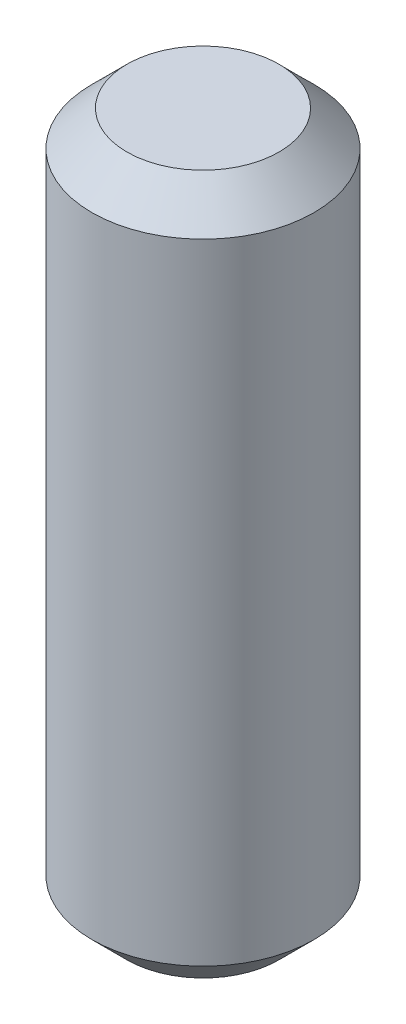
ISO-10303-21;
HEADER;
FILE_DESCRIPTION(('STEP AP214'),'2;1');
FILE_NAME('part.step','',(''),(''),'','','');
FILE_SCHEMA(('AUTOMOTIVE_DESIGN { 1 0 10303 214 1 1 1 1 }'));
ENDSEC;
DATA;
#1=APPLICATION_CONTEXT('core data for automotive mechanical design processes');
#2=APPLICATION_PROTOCOL_DEFINITION('international standard','automotive_design',2000,#1);
#3=PRODUCT_CONTEXT('',#1,'mechanical');
#4=PRODUCT('Part','Part','',(#3));
#5=PRODUCT_RELATED_PRODUCT_CATEGORY('part','',(#4));
#6=PRODUCT_DEFINITION_FORMATION('','',#4);
#7=PRODUCT_DEFINITION_CONTEXT('part definition',#1,'design');
#8=PRODUCT_DEFINITION('design','',#6,#7);
#9=PRODUCT_DEFINITION_SHAPE('','',#8);
#10=(LENGTH_UNIT() NAMED_UNIT(*) SI_UNIT(.MILLI.,.METRE.));
#11=(NAMED_UNIT(*) PLANE_ANGLE_UNIT() SI_UNIT($,.RADIAN.));
#12=(NAMED_UNIT(*) SI_UNIT($,.STERADIAN.) SOLID_ANGLE_UNIT());
#13=UNCERTAINTY_MEASURE_WITH_UNIT(LENGTH_MEASURE(1.E-05),#10,'distance_accuracy_value','');
#14=(GEOMETRIC_REPRESENTATION_CONTEXT(3) GLOBAL_UNCERTAINTY_ASSIGNED_CONTEXT((#13)) GLOBAL_UNIT_ASSIGNED_CONTEXT((#10,
#11,#12)) REPRESENTATION_CONTEXT('',''));
#15=CARTESIAN_POINT('',(0.,0.,0.));
#16=DIRECTION('',(0.,0.,1.));
#17=DIRECTION('',(1.,0.,0.));
#18=AXIS2_PLACEMENT_3D('',#15,#16,#17);
#19=CARTESIAN_POINT('',(0.,10.,0.));
#20=DIRECTION('',(0.,-1.,0.));
#21=DIRECTION('',(0.,0.,-1.));
#22=AXIS2_PLACEMENT_3D('',#19,#20,#21);
#23=CYLINDRICAL_SURFACE('',#22,1.5875);
#24=CARTESIAN_POINT('',(0.,0.500000000000002,0.));
#25=DIRECTION('',(0.,1.,0.));
#26=DIRECTION('',(0.,0.,1.));
#27=AXIS2_PLACEMENT_3D('',#24,#25,#26);
#28=CIRCLE('',#27,1.5875);
#29=CARTESIAN_POINT('',(0.,0.500000000000002,1.5875));
#30=VERTEX_POINT('',#29);
#31=EDGE_CURVE('E40',#30,#30,#28,.T.);
#32=ORIENTED_EDGE('',*,*,#31,.T.);
#33=EDGE_LOOP('',(#32));
#34=FACE_BOUND('',#33,.T.);
#35=CARTESIAN_POINT('',(0.,9.5,0.));
#36=DIRECTION('',(0.,1.,0.));
#37=DIRECTION('',(0.,0.,1.));
#38=AXIS2_PLACEMENT_3D('',#35,#36,#37);
#39=CIRCLE('',#38,1.5875);
#40=CARTESIAN_POINT('',(0.,9.5,1.5875));
#41=VERTEX_POINT('',#40);
#42=EDGE_CURVE('E44',#41,#41,#39,.F.);
#43=ORIENTED_EDGE('',*,*,#42,.T.);
#44=EDGE_LOOP('',(#43));
#45=FACE_BOUND('',#44,.T.);
#46=ADVANCED_FACE('F33',(#34,#45),#23,.T.);
#47=CARTESIAN_POINT('',(0.,10.,0.));
#48=DIRECTION('',(0.,1.,0.));
#49=DIRECTION('',(0.,0.,1.));
#50=AXIS2_PLACEMENT_3D('',#47,#48,#49);
#51=PLANE('',#50);
#52=CARTESIAN_POINT('',(0.,10.,0.));
#53=DIRECTION('',(0.,1.,0.));
#54=DIRECTION('',(0.,0.,1.));
#55=AXIS2_PLACEMENT_3D('',#52,#53,#54);
#56=CIRCLE('',#55,1.0875);
#57=CARTESIAN_POINT('',(0.,10.,1.0875));
#58=VERTEX_POINT('',#57);
#59=EDGE_CURVE('E48',#58,#58,#56,.T.);
#60=ORIENTED_EDGE('',*,*,#59,.T.);
#61=EDGE_LOOP('',(#60));
#62=FACE_BOUND('',#61,.T.);
#63=ADVANCED_FACE('F54',(#62),#51,.T.);
#64=CARTESIAN_POINT('',(0.,0.,0.));
#65=DIRECTION('',(0.,1.,0.));
#66=DIRECTION('',(0.,0.,1.));
#67=AXIS2_PLACEMENT_3D('',#64,#65,#66);
#68=PLANE('',#67);
#69=CARTESIAN_POINT('',(0.,0.,0.));
#70=DIRECTION('',(0.,1.,0.));
#71=DIRECTION('',(0.,0.,1.));
#72=AXIS2_PLACEMENT_3D('',#69,#70,#71);
#73=CIRCLE('',#72,1.0875);
#74=CARTESIAN_POINT('',(0.,0.,1.0875));
#75=VERTEX_POINT('',#74);
#76=EDGE_CURVE('E10',#75,#75,#73,.F.);
#77=ORIENTED_EDGE('',*,*,#76,.T.);
#78=EDGE_LOOP('',(#77));
#79=FACE_BOUND('',#78,.T.);
#80=ADVANCED_FACE('F58',(#79),#68,.F.);
#81=CARTESIAN_POINT('',(0.,10.,0.));
#82=DIRECTION('',(0.,-1.,0.));
#83=DIRECTION('',(0.,0.,-1.));
#84=AXIS2_PLACEMENT_3D('',#81,#82,#83);
#85=CONICAL_SURFACE('',#84,1.0875,0.785398163397448);
#86=ORIENTED_EDGE('',*,*,#42,.F.);
#87=EDGE_LOOP('',(#86));
#88=FACE_BOUND('',#87,.T.);
#89=ORIENTED_EDGE('',*,*,#59,.F.);
#90=EDGE_LOOP('',(#89));
#91=FACE_BOUND('',#90,.T.);
#92=ADVANCED_FACE('F56',(#88,#91),#85,.T.);
#93=CARTESIAN_POINT('',(0.,0.500000000000002,0.));
#94=DIRECTION('',(0.,1.,0.));
#95=DIRECTION('',(0.,0.,1.));
#96=AXIS2_PLACEMENT_3D('',#93,#94,#95);
#97=CONICAL_SURFACE('',#96,1.5875,0.785398163397449);
#98=ORIENTED_EDGE('',*,*,#76,.F.);
#99=EDGE_LOOP('',(#98));
#100=FACE_BOUND('',#99,.T.);
#101=ORIENTED_EDGE('',*,*,#31,.F.);
#102=EDGE_LOOP('',(#101));
#103=FACE_BOUND('',#102,.T.);
#104=ADVANCED_FACE('F35',(#100,#103),#97,.T.);
#105=CLOSED_SHELL('',(#46,#63,#80,#92,#104));
#106=MANIFOLD_SOLID_BREP('B2',#105);
#107=ADVANCED_BREP_SHAPE_REPRESENTATION('',(#18,#106),#14);
#108=SHAPE_DEFINITION_REPRESENTATION(#9,#107);
ENDSEC;
END-ISO-10303-21;
